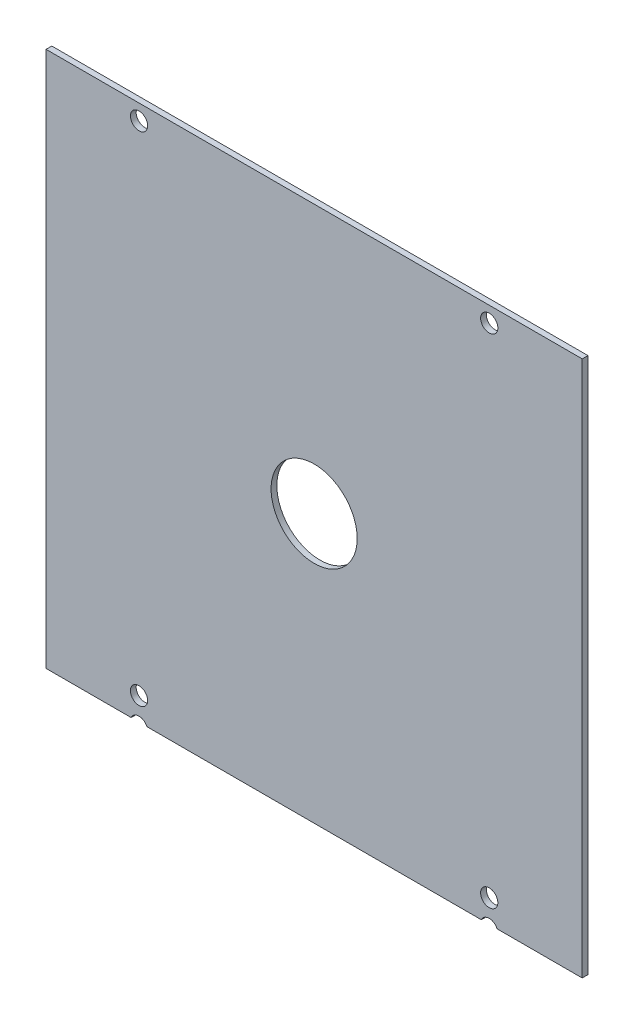
ISO-10303-21;
HEADER;
FILE_DESCRIPTION(('STEP AP214'),'2;1');
FILE_NAME('part.step','',(''),(''),'','','');
FILE_SCHEMA(('AUTOMOTIVE_DESIGN { 1 0 10303 214 1 1 1 1 }'));
ENDSEC;
DATA;
#1=APPLICATION_CONTEXT('core data for automotive mechanical design processes');
#2=APPLICATION_PROTOCOL_DEFINITION('international standard','automotive_design',2000,#1);
#3=PRODUCT_CONTEXT('',#1,'mechanical');
#4=PRODUCT('Part','Part','',(#3));
#5=PRODUCT_RELATED_PRODUCT_CATEGORY('part','',(#4));
#6=PRODUCT_DEFINITION_FORMATION('','',#4);
#7=PRODUCT_DEFINITION_CONTEXT('part definition',#1,'design');
#8=PRODUCT_DEFINITION('design','',#6,#7);
#9=PRODUCT_DEFINITION_SHAPE('','',#8);
#10=(LENGTH_UNIT() NAMED_UNIT(*) SI_UNIT(.MILLI.,.METRE.));
#11=(NAMED_UNIT(*) PLANE_ANGLE_UNIT() SI_UNIT($,.RADIAN.));
#12=(NAMED_UNIT(*) SI_UNIT($,.STERADIAN.) SOLID_ANGLE_UNIT());
#13=UNCERTAINTY_MEASURE_WITH_UNIT(LENGTH_MEASURE(1.E-05),#10,'distance_accuracy_value','');
#14=(GEOMETRIC_REPRESENTATION_CONTEXT(3) GLOBAL_UNCERTAINTY_ASSIGNED_CONTEXT((#13)) GLOBAL_UNIT_ASSIGNED_CONTEXT((#10,
#11,#12)) REPRESENTATION_CONTEXT('',''));
#15=CARTESIAN_POINT('',(0.,0.,0.));
#16=DIRECTION('',(0.,0.,1.));
#17=DIRECTION('',(1.,0.,0.));
#18=AXIS2_PLACEMENT_3D('',#15,#16,#17);
#19=CARTESIAN_POINT('',(46.7,-46.7,1.));
#20=DIRECTION('',(0.,1.,0.));
#21=DIRECTION('',(-1.,0.,0.));
#22=AXIS2_PLACEMENT_3D('',#19,#20,#21);
#23=PLANE('',#22);
#24=DIRECTION('',(1.,0.,0.));
#25=VECTOR('',#24,1.);
#26=CARTESIAN_POINT('',(46.7,-46.7,0.));
#27=LINE('',#26,#25);
#28=CARTESIAN_POINT('',(-46.7,-46.7,0.));
#29=VERTEX_POINT('',#28);
#30=CARTESIAN_POINT('',(-31.8747727084866,-46.7,0.));
#31=VERTEX_POINT('',#30);
#32=EDGE_CURVE('E113',#29,#31,#27,.T.);
#33=ORIENTED_EDGE('',*,*,#32,.T.);
#34=DIRECTION('',(0.,0.,1.));
#35=VECTOR('',#34,1.);
#36=CARTESIAN_POINT('',(-31.8747727084866,-46.7,1.));
#37=LINE('',#36,#35);
#38=CARTESIAN_POINT('',(-31.8747727084866,-46.7,1.));
#39=VERTEX_POINT('',#38);
#40=EDGE_CURVE('E48',#31,#39,#37,.T.);
#41=ORIENTED_EDGE('',*,*,#40,.T.);
#42=DIRECTION('',(1.,0.,0.));
#43=VECTOR('',#42,1.);
#44=CARTESIAN_POINT('',(46.7,-46.7,1.));
#45=LINE('',#44,#43);
#46=CARTESIAN_POINT('',(-46.7,-46.7,1.));
#47=VERTEX_POINT('',#46);
#48=EDGE_CURVE('E157',#47,#39,#45,.T.);
#49=ORIENTED_EDGE('',*,*,#48,.F.);
#50=DIRECTION('',(0.,0.,-1.));
#51=VECTOR('',#50,1.);
#52=CARTESIAN_POINT('',(-46.7,-46.7,1.));
#53=LINE('',#52,#51);
#54=EDGE_CURVE('E11',#47,#29,#53,.T.);
#55=ORIENTED_EDGE('',*,*,#54,.T.);
#56=EDGE_LOOP('',(#33,#41,#49,#55));
#57=FACE_BOUND('',#56,.T.);
#58=ADVANCED_FACE('F33',(#57),#23,.F.);
#59=CARTESIAN_POINT('',(-29.1252272915134,-46.7,1.));
#60=VERTEX_POINT('',#59);
#61=CARTESIAN_POINT('',(29.1252272915135,-46.7,1.));
#62=VERTEX_POINT('',#61);
#63=EDGE_CURVE('E107',#60,#62,#45,.T.);
#64=ORIENTED_EDGE('',*,*,#63,.F.);
#65=DIRECTION('',(0.,0.,1.));
#66=VECTOR('',#65,1.);
#67=CARTESIAN_POINT('',(-29.1252272915134,-46.7,1.));
#68=LINE('',#67,#66);
#69=CARTESIAN_POINT('',(-29.1252272915134,-46.7,0.));
#70=VERTEX_POINT('',#69);
#71=EDGE_CURVE('E99',#60,#70,#68,.F.);
#72=ORIENTED_EDGE('',*,*,#71,.T.);
#73=CARTESIAN_POINT('',(29.1252272915135,-46.7,0.));
#74=VERTEX_POINT('',#73);
#75=EDGE_CURVE('E56',#70,#74,#27,.T.);
#76=ORIENTED_EDGE('',*,*,#75,.T.);
#77=DIRECTION('',(0.,0.,1.));
#78=VECTOR('',#77,1.);
#79=CARTESIAN_POINT('',(29.1252272915135,-46.7,1.));
#80=LINE('',#79,#78);
#81=EDGE_CURVE('E171',#74,#62,#80,.T.);
#82=ORIENTED_EDGE('',*,*,#81,.T.);
#83=EDGE_LOOP('',(#64,#72,#76,#82));
#84=FACE_BOUND('',#83,.T.);
#85=ADVANCED_FACE('F106',(#84),#23,.F.);
#86=CARTESIAN_POINT('',(-46.7,-46.7,1.));
#87=DIRECTION('',(1.,0.,0.));
#88=DIRECTION('',(0.,0.,-1.));
#89=AXIS2_PLACEMENT_3D('',#86,#87,#88);
#90=PLANE('',#89);
#91=DIRECTION('',(0.,-1.,0.));
#92=VECTOR('',#91,1.);
#93=CARTESIAN_POINT('',(-46.7,-46.7,0.));
#94=LINE('',#93,#92);
#95=CARTESIAN_POINT('',(-46.7,46.7,0.));
#96=VERTEX_POINT('',#95);
#97=EDGE_CURVE('E117',#96,#29,#94,.T.);
#98=ORIENTED_EDGE('',*,*,#97,.T.);
#99=ORIENTED_EDGE('',*,*,#54,.F.);
#100=DIRECTION('',(0.,-1.,0.));
#101=VECTOR('',#100,1.);
#102=CARTESIAN_POINT('',(-46.7,-46.7,1.));
#103=LINE('',#102,#101);
#104=CARTESIAN_POINT('',(-46.7,46.7,1.));
#105=VERTEX_POINT('',#104);
#106=EDGE_CURVE('E124',#105,#47,#103,.T.);
#107=ORIENTED_EDGE('',*,*,#106,.F.);
#108=DIRECTION('',(0.,0.,-1.));
#109=VECTOR('',#108,1.);
#110=CARTESIAN_POINT('',(-46.7,46.7,1.));
#111=LINE('',#110,#109);
#112=EDGE_CURVE('E125',#105,#96,#111,.T.);
#113=ORIENTED_EDGE('',*,*,#112,.T.);
#114=EDGE_LOOP('',(#98,#99,#107,#113));
#115=FACE_BOUND('',#114,.T.);
#116=ADVANCED_FACE('F35',(#115),#90,.F.);
#117=CARTESIAN_POINT('',(31.8747727084865,-46.7,1.));
#118=VERTEX_POINT('',#117);
#119=CARTESIAN_POINT('',(46.7,-46.7,1.));
#120=VERTEX_POINT('',#119);
#121=EDGE_CURVE('E154',#118,#120,#45,.T.);
#122=ORIENTED_EDGE('',*,*,#121,.F.);
#123=DIRECTION('',(0.,0.,1.));
#124=VECTOR('',#123,1.);
#125=CARTESIAN_POINT('',(31.8747727084865,-46.7,1.));
#126=LINE('',#125,#124);
#127=CARTESIAN_POINT('',(31.8747727084865,-46.7,0.));
#128=VERTEX_POINT('',#127);
#129=EDGE_CURVE('E169',#118,#128,#126,.F.);
#130=ORIENTED_EDGE('',*,*,#129,.T.);
#131=CARTESIAN_POINT('',(46.7,-46.7,0.));
#132=VERTEX_POINT('',#131);
#133=EDGE_CURVE('E114',#128,#132,#27,.T.);
#134=ORIENTED_EDGE('',*,*,#133,.T.);
#135=DIRECTION('',(0.,0.,-1.));
#136=VECTOR('',#135,1.);
#137=CARTESIAN_POINT('',(46.7,-46.7,1.));
#138=LINE('',#137,#136);
#139=EDGE_CURVE('E41',#120,#132,#138,.T.);
#140=ORIENTED_EDGE('',*,*,#139,.F.);
#141=EDGE_LOOP('',(#122,#130,#134,#140));
#142=FACE_BOUND('',#141,.T.);
#143=ADVANCED_FACE('F168',(#142),#23,.F.);
#144=CARTESIAN_POINT('',(46.7,-46.7,1.));
#145=DIRECTION('',(-1.,0.,0.));
#146=DIRECTION('',(0.,0.,1.));
#147=AXIS2_PLACEMENT_3D('',#144,#145,#146);
#148=PLANE('',#147);
#149=DIRECTION('',(0.,1.,0.));
#150=VECTOR('',#149,1.);
#151=CARTESIAN_POINT('',(46.7,-46.7,0.));
#152=LINE('',#151,#150);
#153=CARTESIAN_POINT('',(46.7,46.7,0.));
#154=VERTEX_POINT('',#153);
#155=EDGE_CURVE('E116',#132,#154,#152,.T.);
#156=ORIENTED_EDGE('',*,*,#155,.T.);
#157=DIRECTION('',(0.,0.,-1.));
#158=VECTOR('',#157,1.);
#159=CARTESIAN_POINT('',(46.7,46.7,1.));
#160=LINE('',#159,#158);
#161=CARTESIAN_POINT('',(46.7,46.7,1.));
#162=VERTEX_POINT('',#161);
#163=EDGE_CURVE('E128',#162,#154,#160,.T.);
#164=ORIENTED_EDGE('',*,*,#163,.F.);
#165=DIRECTION('',(0.,1.,0.));
#166=VECTOR('',#165,1.);
#167=CARTESIAN_POINT('',(46.7,-46.7,1.));
#168=LINE('',#167,#166);
#169=EDGE_CURVE('E138',#120,#162,#168,.T.);
#170=ORIENTED_EDGE('',*,*,#169,.F.);
#171=ORIENTED_EDGE('',*,*,#139,.T.);
#172=EDGE_LOOP('',(#156,#164,#170,#171));
#173=FACE_BOUND('',#172,.T.);
#174=ADVANCED_FACE('F136',(#173),#148,.F.);
#175=CARTESIAN_POINT('',(46.7,46.7,1.));
#176=DIRECTION('',(0.,-1.,0.));
#177=DIRECTION('',(1.,0.,0.));
#178=AXIS2_PLACEMENT_3D('',#175,#176,#177);
#179=PLANE('',#178);
#180=DIRECTION('',(-1.,0.,0.));
#181=VECTOR('',#180,1.);
#182=CARTESIAN_POINT('',(46.7,46.7,0.));
#183=LINE('',#182,#181);
#184=EDGE_CURVE('E122',#154,#96,#183,.T.);
#185=ORIENTED_EDGE('',*,*,#184,.T.);
#186=ORIENTED_EDGE('',*,*,#112,.F.);
#187=DIRECTION('',(-1.,0.,0.));
#188=VECTOR('',#187,1.);
#189=CARTESIAN_POINT('',(46.7,46.7,1.));
#190=LINE('',#189,#188);
#191=EDGE_CURVE('E129',#162,#105,#190,.T.);
#192=ORIENTED_EDGE('',*,*,#191,.F.);
#193=ORIENTED_EDGE('',*,*,#163,.T.);
#194=EDGE_LOOP('',(#185,#186,#192,#193));
#195=FACE_BOUND('',#194,.T.);
#196=ADVANCED_FACE('F146',(#195),#179,.F.);
#197=CARTESIAN_POINT('',(0.,0.,1.));
#198=DIRECTION('',(0.,0.,1.));
#199=DIRECTION('',(1.,0.,0.));
#200=AXIS2_PLACEMENT_3D('',#197,#198,#199);
#201=PLANE('',#200);
#202=CARTESIAN_POINT('',(0.,0.,1.));
#203=DIRECTION('',(0.,0.,1.));
#204=DIRECTION('',(1.,0.,0.));
#205=AXIS2_PLACEMENT_3D('',#202,#203,#204);
#206=CIRCLE('',#205,7.5);
#207=CARTESIAN_POINT('',(7.5,0.,1.));
#208=VERTEX_POINT('',#207);
#209=EDGE_CURVE('E319',#208,#208,#206,.T.);
#210=ORIENTED_EDGE('',*,*,#209,.F.);
#211=EDGE_LOOP('',(#210));
#212=FACE_BOUND('',#211,.T.);
#213=CARTESIAN_POINT('',(-30.5,-47.3000000000004,1.));
#214=DIRECTION('',(0.,0.,1.));
#215=DIRECTION('',(1.,0.,0.));
#216=AXIS2_PLACEMENT_3D('',#213,#214,#215);
#217=CIRCLE('',#216,1.5);
#218=EDGE_CURVE('E103',#60,#39,#217,.T.);
#219=ORIENTED_EDGE('',*,*,#218,.F.);
#220=ORIENTED_EDGE('',*,*,#63,.T.);
#221=CARTESIAN_POINT('',(30.5,-47.3000000000006,1.));
#222=DIRECTION('',(0.,0.,1.));
#223=DIRECTION('',(1.,0.,0.));
#224=AXIS2_PLACEMENT_3D('',#221,#222,#223);
#225=CIRCLE('',#224,1.5);
#226=EDGE_CURVE('E166',#118,#62,#225,.T.);
#227=ORIENTED_EDGE('',*,*,#226,.F.);
#228=ORIENTED_EDGE('',*,*,#121,.T.);
#229=ORIENTED_EDGE('',*,*,#169,.T.);
#230=ORIENTED_EDGE('',*,*,#191,.T.);
#231=ORIENTED_EDGE('',*,*,#106,.T.);
#232=ORIENTED_EDGE('',*,*,#48,.T.);
#233=EDGE_LOOP('',(#219,#220,#227,#228,#229,#230,#231,#232));
#234=FACE_BOUND('',#233,.T.);
#235=CARTESIAN_POINT('',(30.5,-42.7,1.));
#236=DIRECTION('',(0.,0.,1.));
#237=DIRECTION('',(1.,0.,0.));
#238=AXIS2_PLACEMENT_3D('',#235,#236,#237);
#239=CIRCLE('',#238,1.5);
#240=CARTESIAN_POINT('',(32.,-42.7,1.));
#241=VERTEX_POINT('',#240);
#242=EDGE_CURVE('E173',#241,#241,#239,.T.);
#243=ORIENTED_EDGE('',*,*,#242,.F.);
#244=EDGE_LOOP('',(#243));
#245=FACE_BOUND('',#244,.T.);
#246=CARTESIAN_POINT('',(-30.5,-42.7,1.));
#247=DIRECTION('',(0.,0.,1.));
#248=DIRECTION('',(1.,0.,0.));
#249=AXIS2_PLACEMENT_3D('',#246,#247,#248);
#250=CIRCLE('',#249,1.5);
#251=CARTESIAN_POINT('',(-29.,-42.7,1.));
#252=VERTEX_POINT('',#251);
#253=EDGE_CURVE('E183',#252,#252,#250,.T.);
#254=ORIENTED_EDGE('',*,*,#253,.F.);
#255=EDGE_LOOP('',(#254));
#256=FACE_BOUND('',#255,.T.);
#257=CARTESIAN_POINT('',(-30.5,44.,1.));
#258=DIRECTION('',(0.,0.,1.));
#259=DIRECTION('',(1.,0.,0.));
#260=AXIS2_PLACEMENT_3D('',#257,#258,#259);
#261=CIRCLE('',#260,1.5);
#262=CARTESIAN_POINT('',(-29.,44.,1.));
#263=VERTEX_POINT('',#262);
#264=EDGE_CURVE('E189',#263,#263,#261,.T.);
#265=ORIENTED_EDGE('',*,*,#264,.F.);
#266=EDGE_LOOP('',(#265));
#267=FACE_BOUND('',#266,.T.);
#268=CARTESIAN_POINT('',(30.5,44.,1.));
#269=DIRECTION('',(0.,0.,1.));
#270=DIRECTION('',(1.,0.,0.));
#271=AXIS2_PLACEMENT_3D('',#268,#269,#270);
#272=CIRCLE('',#271,1.5);
#273=CARTESIAN_POINT('',(32.,44.,1.));
#274=VERTEX_POINT('',#273);
#275=EDGE_CURVE('E194',#274,#274,#272,.T.);
#276=ORIENTED_EDGE('',*,*,#275,.F.);
#277=EDGE_LOOP('',(#276));
#278=FACE_BOUND('',#277,.T.);
#279=ADVANCED_FACE('F162',(#212,#234,#245,#256,#267,#278),#201,.T.);
#280=CARTESIAN_POINT('',(0.,0.,0.));
#281=DIRECTION('',(0.,0.,1.));
#282=DIRECTION('',(1.,0.,0.));
#283=AXIS2_PLACEMENT_3D('',#280,#281,#282);
#284=PLANE('',#283);
#285=CARTESIAN_POINT('',(0.,0.,0.));
#286=DIRECTION('',(0.,0.,1.));
#287=DIRECTION('',(1.,0.,0.));
#288=AXIS2_PLACEMENT_3D('',#285,#286,#287);
#289=CIRCLE('',#288,7.5);
#290=CARTESIAN_POINT('',(7.5,0.,0.));
#291=VERTEX_POINT('',#290);
#292=EDGE_CURVE('E316',#291,#291,#289,.T.);
#293=ORIENTED_EDGE('',*,*,#292,.T.);
#294=EDGE_LOOP('',(#293));
#295=FACE_BOUND('',#294,.T.);
#296=CARTESIAN_POINT('',(30.5,-42.7,0.));
#297=DIRECTION('',(0.,0.,1.));
#298=DIRECTION('',(1.,0.,0.));
#299=AXIS2_PLACEMENT_3D('',#296,#297,#298);
#300=CIRCLE('',#299,1.5);
#301=CARTESIAN_POINT('',(32.,-42.7,0.));
#302=VERTEX_POINT('',#301);
#303=EDGE_CURVE('E180',#302,#302,#300,.T.);
#304=ORIENTED_EDGE('',*,*,#303,.T.);
#305=EDGE_LOOP('',(#304));
#306=FACE_BOUND('',#305,.T.);
#307=CARTESIAN_POINT('',(-30.5,-42.7,0.));
#308=DIRECTION('',(0.,0.,1.));
#309=DIRECTION('',(1.,0.,0.));
#310=AXIS2_PLACEMENT_3D('',#307,#308,#309);
#311=CIRCLE('',#310,1.5);
#312=CARTESIAN_POINT('',(-29.,-42.7,0.));
#313=VERTEX_POINT('',#312);
#314=EDGE_CURVE('E186',#313,#313,#311,.T.);
#315=ORIENTED_EDGE('',*,*,#314,.T.);
#316=EDGE_LOOP('',(#315));
#317=FACE_BOUND('',#316,.T.);
#318=CARTESIAN_POINT('',(-30.5,44.,0.));
#319=DIRECTION('',(0.,0.,1.));
#320=DIRECTION('',(1.,0.,0.));
#321=AXIS2_PLACEMENT_3D('',#318,#319,#320);
#322=CIRCLE('',#321,1.5);
#323=CARTESIAN_POINT('',(-29.,44.,0.));
#324=VERTEX_POINT('',#323);
#325=EDGE_CURVE('E192',#324,#324,#322,.T.);
#326=ORIENTED_EDGE('',*,*,#325,.T.);
#327=EDGE_LOOP('',(#326));
#328=FACE_BOUND('',#327,.T.);
#329=CARTESIAN_POINT('',(30.5,44.,0.));
#330=DIRECTION('',(0.,0.,1.));
#331=DIRECTION('',(1.,0.,0.));
#332=AXIS2_PLACEMENT_3D('',#329,#330,#331);
#333=CIRCLE('',#332,1.5);
#334=CARTESIAN_POINT('',(32.,44.,0.));
#335=VERTEX_POINT('',#334);
#336=EDGE_CURVE('E159',#335,#335,#333,.T.);
#337=ORIENTED_EDGE('',*,*,#336,.T.);
#338=EDGE_LOOP('',(#337));
#339=FACE_BOUND('',#338,.T.);
#340=ORIENTED_EDGE('',*,*,#75,.F.);
#341=CARTESIAN_POINT('',(-30.5,-47.3000000000004,0.));
#342=DIRECTION('',(0.,0.,1.));
#343=DIRECTION('',(1.,0.,0.));
#344=AXIS2_PLACEMENT_3D('',#341,#342,#343);
#345=CIRCLE('',#344,1.5);
#346=EDGE_CURVE('E97',#70,#31,#345,.T.);
#347=ORIENTED_EDGE('',*,*,#346,.T.);
#348=ORIENTED_EDGE('',*,*,#32,.F.);
#349=ORIENTED_EDGE('',*,*,#97,.F.);
#350=ORIENTED_EDGE('',*,*,#184,.F.);
#351=ORIENTED_EDGE('',*,*,#155,.F.);
#352=ORIENTED_EDGE('',*,*,#133,.F.);
#353=CARTESIAN_POINT('',(30.5,-47.3000000000006,0.));
#354=DIRECTION('',(0.,0.,1.));
#355=DIRECTION('',(1.,0.,0.));
#356=AXIS2_PLACEMENT_3D('',#353,#354,#355);
#357=CIRCLE('',#356,1.5);
#358=EDGE_CURVE('E112',#128,#74,#357,.T.);
#359=ORIENTED_EDGE('',*,*,#358,.T.);
#360=EDGE_LOOP('',(#340,#347,#348,#349,#350,#351,#352,#359));
#361=FACE_BOUND('',#360,.T.);
#362=ADVANCED_FACE('F110',(#295,#306,#317,#328,#339,#361),#284,.F.);
#363=CARTESIAN_POINT('',(30.5,44.,1.));
#364=DIRECTION('',(0.,0.,1.));
#365=DIRECTION('',(1.,0.,0.));
#366=AXIS2_PLACEMENT_3D('',#363,#364,#365);
#367=CYLINDRICAL_SURFACE('',#366,1.5);
#368=ORIENTED_EDGE('',*,*,#336,.F.);
#369=EDGE_LOOP('',(#368));
#370=FACE_BOUND('',#369,.T.);
#371=ORIENTED_EDGE('',*,*,#275,.T.);
#372=EDGE_LOOP('',(#371));
#373=FACE_BOUND('',#372,.T.);
#374=ADVANCED_FACE('F202',(#370,#373),#367,.F.);
#375=CARTESIAN_POINT('',(-30.5,44.,1.));
#376=DIRECTION('',(0.,0.,1.));
#377=DIRECTION('',(1.,0.,0.));
#378=AXIS2_PLACEMENT_3D('',#375,#376,#377);
#379=CYLINDRICAL_SURFACE('',#378,1.5);
#380=ORIENTED_EDGE('',*,*,#325,.F.);
#381=EDGE_LOOP('',(#380));
#382=FACE_BOUND('',#381,.T.);
#383=ORIENTED_EDGE('',*,*,#264,.T.);
#384=EDGE_LOOP('',(#383));
#385=FACE_BOUND('',#384,.T.);
#386=ADVANCED_FACE('F204',(#382,#385),#379,.F.);
#387=CARTESIAN_POINT('',(-30.5,-42.7,1.));
#388=DIRECTION('',(0.,0.,1.));
#389=DIRECTION('',(1.,0.,0.));
#390=AXIS2_PLACEMENT_3D('',#387,#388,#389);
#391=CYLINDRICAL_SURFACE('',#390,1.5);
#392=ORIENTED_EDGE('',*,*,#314,.F.);
#393=EDGE_LOOP('',(#392));
#394=FACE_BOUND('',#393,.T.);
#395=ORIENTED_EDGE('',*,*,#253,.T.);
#396=EDGE_LOOP('',(#395));
#397=FACE_BOUND('',#396,.T.);
#398=ADVANCED_FACE('F210',(#394,#397),#391,.F.);
#399=CARTESIAN_POINT('',(30.5,-42.7,1.));
#400=DIRECTION('',(0.,0.,1.));
#401=DIRECTION('',(1.,0.,0.));
#402=AXIS2_PLACEMENT_3D('',#399,#400,#401);
#403=CYLINDRICAL_SURFACE('',#402,1.5);
#404=ORIENTED_EDGE('',*,*,#303,.F.);
#405=EDGE_LOOP('',(#404));
#406=FACE_BOUND('',#405,.T.);
#407=ORIENTED_EDGE('',*,*,#242,.T.);
#408=EDGE_LOOP('',(#407));
#409=FACE_BOUND('',#408,.T.);
#410=ADVANCED_FACE('F263',(#406,#409),#403,.F.);
#411=CARTESIAN_POINT('',(30.5,-47.3000000000006,1.));
#412=DIRECTION('',(0.,0.,1.));
#413=DIRECTION('',(1.,0.,0.));
#414=AXIS2_PLACEMENT_3D('',#411,#412,#413);
#415=CYLINDRICAL_SURFACE('',#414,1.5);
#416=ORIENTED_EDGE('',*,*,#358,.F.);
#417=ORIENTED_EDGE('',*,*,#129,.F.);
#418=ORIENTED_EDGE('',*,*,#226,.T.);
#419=ORIENTED_EDGE('',*,*,#81,.F.);
#420=EDGE_LOOP('',(#416,#417,#418,#419));
#421=FACE_BOUND('',#420,.T.);
#422=ADVANCED_FACE('F273',(#421),#415,.F.);
#423=CARTESIAN_POINT('',(-30.5,-47.3000000000004,1.));
#424=DIRECTION('',(0.,0.,1.));
#425=DIRECTION('',(1.,0.,0.));
#426=AXIS2_PLACEMENT_3D('',#423,#424,#425);
#427=CYLINDRICAL_SURFACE('',#426,1.5);
#428=ORIENTED_EDGE('',*,*,#346,.F.);
#429=ORIENTED_EDGE('',*,*,#71,.F.);
#430=ORIENTED_EDGE('',*,*,#218,.T.);
#431=ORIENTED_EDGE('',*,*,#40,.F.);
#432=EDGE_LOOP('',(#428,#429,#430,#431));
#433=FACE_BOUND('',#432,.T.);
#434=ADVANCED_FACE('F98',(#433),#427,.F.);
#435=CARTESIAN_POINT('',(0.,0.,0.));
#436=DIRECTION('',(0.,0.,1.));
#437=DIRECTION('',(1.,0.,0.));
#438=AXIS2_PLACEMENT_3D('',#435,#436,#437);
#439=CYLINDRICAL_SURFACE('',#438,7.5);
#440=ORIENTED_EDGE('',*,*,#292,.F.);
#441=EDGE_LOOP('',(#440));
#442=FACE_BOUND('',#441,.T.);
#443=ORIENTED_EDGE('',*,*,#209,.T.);
#444=EDGE_LOOP('',(#443));
#445=FACE_BOUND('',#444,.T.);
#446=ADVANCED_FACE('F291',(#442,#445),#439,.F.);
#447=CLOSED_SHELL('',(#58,#85,#116,#143,#174,#196,#279,#362,#374,#386,#398,#410,#422,#434,#446));
#448=MANIFOLD_SOLID_BREP('B2',#447);
#449=ADVANCED_BREP_SHAPE_REPRESENTATION('',(#18,#448),#14);
#450=SHAPE_DEFINITION_REPRESENTATION(#9,#449);
ENDSEC;
END-ISO-10303-21;
